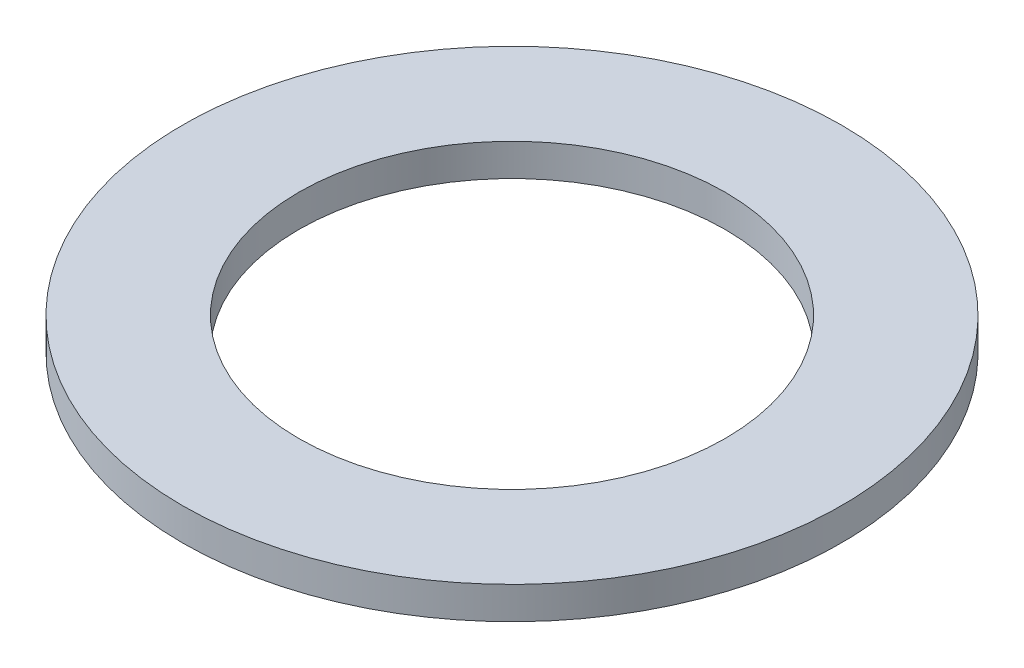
ISO-10303-21;
HEADER;
FILE_DESCRIPTION(('STEP AP214'),'2;1');
FILE_NAME('part.step','',(''),(''),'','','');
FILE_SCHEMA(('AUTOMOTIVE_DESIGN { 1 0 10303 214 1 1 1 1 }'));
ENDSEC;
DATA;
#1=APPLICATION_CONTEXT('core data for automotive mechanical design processes');
#2=APPLICATION_PROTOCOL_DEFINITION('international standard','automotive_design',2000,#1);
#3=PRODUCT_CONTEXT('',#1,'mechanical');
#4=PRODUCT('Part','Part','',(#3));
#5=PRODUCT_RELATED_PRODUCT_CATEGORY('part','',(#4));
#6=PRODUCT_DEFINITION_FORMATION('','',#4);
#7=PRODUCT_DEFINITION_CONTEXT('part definition',#1,'design');
#8=PRODUCT_DEFINITION('design','',#6,#7);
#9=PRODUCT_DEFINITION_SHAPE('','',#8);
#10=(LENGTH_UNIT() NAMED_UNIT(*) SI_UNIT(.MILLI.,.METRE.));
#11=(NAMED_UNIT(*) PLANE_ANGLE_UNIT() SI_UNIT($,.RADIAN.));
#12=(NAMED_UNIT(*) SI_UNIT($,.STERADIAN.) SOLID_ANGLE_UNIT());
#13=UNCERTAINTY_MEASURE_WITH_UNIT(LENGTH_MEASURE(1.E-05),#10,'distance_accuracy_value','');
#14=(GEOMETRIC_REPRESENTATION_CONTEXT(3) GLOBAL_UNCERTAINTY_ASSIGNED_CONTEXT((#13)) GLOBAL_UNIT_ASSIGNED_CONTEXT((#10,
#11,#12)) REPRESENTATION_CONTEXT('',''));
#15=CARTESIAN_POINT('',(0.,0.,0.));
#16=DIRECTION('',(0.,0.,1.));
#17=DIRECTION('',(1.,0.,0.));
#18=AXIS2_PLACEMENT_3D('',#15,#16,#17);
#19=CARTESIAN_POINT('',(5.1,2.,0.));
#20=DIRECTION('',(0.,-1.,0.));
#21=DIRECTION('',(0.,0.,-1.));
#22=AXIS2_PLACEMENT_3D('',#19,#20,#21);
#23=PLANE('',#22);
#24=CARTESIAN_POINT('',(0.,2.,0.));
#25=DIRECTION('',(0.,-1.,0.));
#26=DIRECTION('',(0.,0.,-1.));
#27=AXIS2_PLACEMENT_3D('',#24,#25,#26);
#28=CIRCLE('',#27,5.1);
#29=CARTESIAN_POINT('',(0.,2.,-5.1));
#30=VERTEX_POINT('',#29);
#31=EDGE_CURVE('E49',#30,#30,#28,.T.);
#32=ORIENTED_EDGE('',*,*,#31,.T.);
#33=EDGE_LOOP('',(#32));
#34=FACE_BOUND('',#33,.T.);
#35=CARTESIAN_POINT('',(0.,2.,0.));
#36=DIRECTION('',(0.,-1.,0.));
#37=DIRECTION('',(0.,0.,-1.));
#38=AXIS2_PLACEMENT_3D('',#35,#36,#37);
#39=CIRCLE('',#38,3.3);
#40=CARTESIAN_POINT('',(0.,2.,-3.3));
#41=VERTEX_POINT('',#40);
#42=EDGE_CURVE('E10',#41,#41,#39,.T.);
#43=ORIENTED_EDGE('',*,*,#42,.F.);
#44=EDGE_LOOP('',(#43));
#45=FACE_BOUND('',#44,.T.);
#46=ADVANCED_FACE('F35',(#34,#45),#23,.T.);
#47=CARTESIAN_POINT('',(0.,-200.,0.));
#48=DIRECTION('',(0.,-1.,0.));
#49=DIRECTION('',(0.,0.,-1.));
#50=AXIS2_PLACEMENT_3D('',#47,#48,#49);
#51=CYLINDRICAL_SURFACE('',#50,3.3);
#52=ORIENTED_EDGE('',*,*,#42,.T.);
#53=EDGE_LOOP('',(#52));
#54=FACE_BOUND('',#53,.T.);
#55=CARTESIAN_POINT('',(0.,2.5,0.));
#56=DIRECTION('',(0.,-1.,0.));
#57=DIRECTION('',(0.,0.,-1.));
#58=AXIS2_PLACEMENT_3D('',#55,#56,#57);
#59=CIRCLE('',#58,3.3);
#60=CARTESIAN_POINT('',(0.,2.5,-3.3));
#61=VERTEX_POINT('',#60);
#62=EDGE_CURVE('E41',#61,#61,#59,.T.);
#63=ORIENTED_EDGE('',*,*,#62,.F.);
#64=EDGE_LOOP('',(#63));
#65=FACE_BOUND('',#64,.T.);
#66=ADVANCED_FACE('F65',(#54,#65),#51,.F.);
#67=CARTESIAN_POINT('',(3.3,2.5,0.));
#68=DIRECTION('',(0.,1.,0.));
#69=DIRECTION('',(0.,0.,1.));
#70=AXIS2_PLACEMENT_3D('',#67,#68,#69);
#71=PLANE('',#70);
#72=ORIENTED_EDGE('',*,*,#62,.T.);
#73=EDGE_LOOP('',(#72));
#74=FACE_BOUND('',#73,.T.);
#75=CARTESIAN_POINT('',(0.,2.5,0.));
#76=DIRECTION('',(0.,-1.,0.));
#77=DIRECTION('',(0.,0.,-1.));
#78=AXIS2_PLACEMENT_3D('',#75,#76,#77);
#79=CIRCLE('',#78,5.1);
#80=CARTESIAN_POINT('',(0.,2.5,-5.1));
#81=VERTEX_POINT('',#80);
#82=EDGE_CURVE('E45',#81,#81,#79,.T.);
#83=ORIENTED_EDGE('',*,*,#82,.F.);
#84=EDGE_LOOP('',(#83));
#85=FACE_BOUND('',#84,.T.);
#86=ADVANCED_FACE('F59',(#74,#85),#71,.T.);
#87=CARTESIAN_POINT('',(0.,-200.,0.));
#88=DIRECTION('',(0.,-1.,0.));
#89=DIRECTION('',(0.,0.,-1.));
#90=AXIS2_PLACEMENT_3D('',#87,#88,#89);
#91=CYLINDRICAL_SURFACE('',#90,5.1);
#92=ORIENTED_EDGE('',*,*,#82,.T.);
#93=EDGE_LOOP('',(#92));
#94=FACE_BOUND('',#93,.T.);
#95=ORIENTED_EDGE('',*,*,#31,.F.);
#96=EDGE_LOOP('',(#95));
#97=FACE_BOUND('',#96,.T.);
#98=ADVANCED_FACE('F57',(#94,#97),#91,.T.);
#99=CLOSED_SHELL('',(#46,#66,#86,#98));
#100=MANIFOLD_SOLID_BREP('B2',#99);
#101=ADVANCED_BREP_SHAPE_REPRESENTATION('',(#18,#100),#14);
#102=SHAPE_DEFINITION_REPRESENTATION(#9,#101);
ENDSEC;
END-ISO-10303-21;
